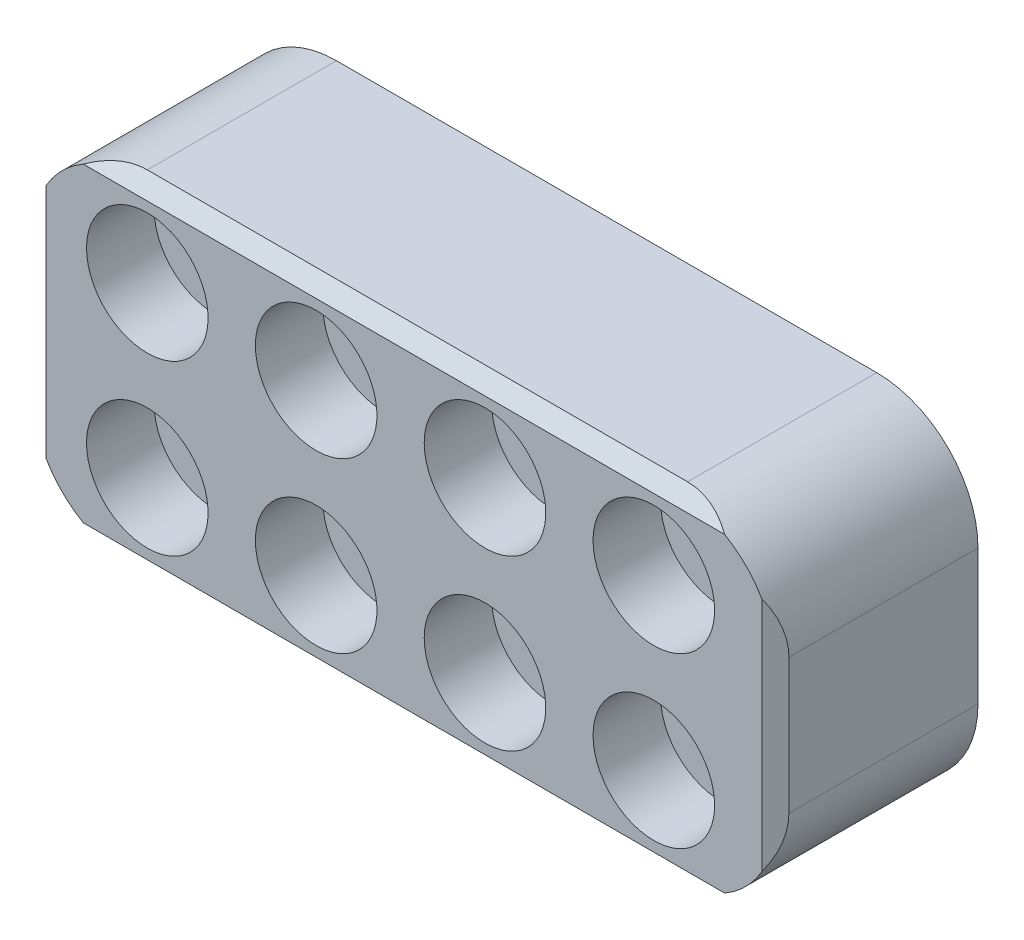
ISO-10303-21;
HEADER;
FILE_DESCRIPTION(('STEP AP214'),'2;1');
FILE_NAME('part.step','',(''),(''),'','','');
FILE_SCHEMA(('AUTOMOTIVE_DESIGN { 1 0 10303 214 1 1 1 1 }'));
ENDSEC;
DATA;
#1=APPLICATION_CONTEXT('core data for automotive mechanical design processes');
#2=APPLICATION_PROTOCOL_DEFINITION('international standard','automotive_design',2000,#1);
#3=PRODUCT_CONTEXT('',#1,'mechanical');
#4=PRODUCT('Part','Part','',(#3));
#5=PRODUCT_RELATED_PRODUCT_CATEGORY('part','',(#4));
#6=PRODUCT_DEFINITION_FORMATION('','',#4);
#7=PRODUCT_DEFINITION_CONTEXT('part definition',#1,'design');
#8=PRODUCT_DEFINITION('design','',#6,#7);
#9=PRODUCT_DEFINITION_SHAPE('','',#8);
#10=(LENGTH_UNIT() NAMED_UNIT(*) SI_UNIT(.MILLI.,.METRE.));
#11=(NAMED_UNIT(*) PLANE_ANGLE_UNIT() SI_UNIT($,.RADIAN.));
#12=(NAMED_UNIT(*) SI_UNIT($,.STERADIAN.) SOLID_ANGLE_UNIT());
#13=UNCERTAINTY_MEASURE_WITH_UNIT(LENGTH_MEASURE(1.E-05),#10,'distance_accuracy_value','');
#14=(GEOMETRIC_REPRESENTATION_CONTEXT(3) GLOBAL_UNCERTAINTY_ASSIGNED_CONTEXT((#13)) GLOBAL_UNIT_ASSIGNED_CONTEXT((#10,
#11,#12)) REPRESENTATION_CONTEXT('',''));
#15=CARTESIAN_POINT('',(0.,0.,0.));
#16=DIRECTION('',(0.,0.,1.));
#17=DIRECTION('',(1.,0.,0.));
#18=AXIS2_PLACEMENT_3D('',#15,#16,#17);
#19=CARTESIAN_POINT('',(0.,0.,0.));
#20=DIRECTION('',(-1.,0.,0.));
#21=DIRECTION('',(0.,0.,1.));
#22=AXIS2_PLACEMENT_3D('',#19,#20,#21);
#23=PLANE('',#22);
#24=DIRECTION('',(0.,0.,-1.));
#25=VECTOR('',#24,1.);
#26=CARTESIAN_POINT('',(0.,-1.5,2.8));
#27=LINE('',#26,#25);
#28=CARTESIAN_POINT('',(0.,-1.5,2.8));
#29=VERTEX_POINT('',#28);
#30=CARTESIAN_POINT('',(0.,-1.5,0.));
#31=VERTEX_POINT('',#30);
#32=EDGE_CURVE('E248',#29,#31,#27,.T.);
#33=ORIENTED_EDGE('',*,*,#32,.T.);
#34=DIRECTION('',(0.,-1.,0.));
#35=VECTOR('',#34,1.);
#36=CARTESIAN_POINT('',(0.,-1.5,0.));
#37=LINE('',#36,#35);
#38=CARTESIAN_POINT('',(0.,-3.5,0.));
#39=VERTEX_POINT('',#38);
#40=EDGE_CURVE('E336',#31,#39,#37,.T.);
#41=ORIENTED_EDGE('',*,*,#40,.T.);
#42=DIRECTION('',(0.,0.,-1.));
#43=VECTOR('',#42,1.);
#44=CARTESIAN_POINT('',(0.,-3.5,2.8));
#45=LINE('',#44,#43);
#46=CARTESIAN_POINT('',(0.,-3.5,2.8));
#47=VERTEX_POINT('',#46);
#48=EDGE_CURVE('E288',#47,#39,#45,.T.);
#49=ORIENTED_EDGE('',*,*,#48,.F.);
#50=DIRECTION('',(0.,-1.,0.));
#51=VECTOR('',#50,1.);
#52=CARTESIAN_POINT('',(0.,-1.5,2.8));
#53=LINE('',#52,#51);
#54=EDGE_CURVE('E287',#29,#47,#53,.T.);
#55=ORIENTED_EDGE('',*,*,#54,.F.);
#56=EDGE_LOOP('',(#33,#41,#49,#55));
#57=FACE_BOUND('',#56,.T.);
#58=ADVANCED_FACE('F17',(#57),#23,.T.);
#59=CARTESIAN_POINT('',(11.,0.,0.));
#60=DIRECTION('',(0.,1.,0.));
#61=DIRECTION('',(1.,0.,0.));
#62=AXIS2_PLACEMENT_3D('',#59,#60,#61);
#63=PLANE('',#62);
#64=DIRECTION('',(0.,0.,-1.));
#65=VECTOR('',#64,1.);
#66=CARTESIAN_POINT('',(9.5,0.,2.8));
#67=LINE('',#66,#65);
#68=CARTESIAN_POINT('',(9.5,0.,2.8));
#69=VERTEX_POINT('',#68);
#70=CARTESIAN_POINT('',(9.5,0.,0.));
#71=VERTEX_POINT('',#70);
#72=EDGE_CURVE('E28',#69,#71,#67,.T.);
#73=ORIENTED_EDGE('',*,*,#72,.T.);
#74=DIRECTION('',(-1.,0.,0.));
#75=VECTOR('',#74,1.);
#76=CARTESIAN_POINT('',(9.5,0.,0.));
#77=LINE('',#76,#75);
#78=CARTESIAN_POINT('',(1.5,0.,0.));
#79=VERTEX_POINT('',#78);
#80=EDGE_CURVE('E485',#71,#79,#77,.T.);
#81=ORIENTED_EDGE('',*,*,#80,.T.);
#82=DIRECTION('',(0.,0.,-1.));
#83=VECTOR('',#82,1.);
#84=CARTESIAN_POINT('',(1.5,0.,2.8));
#85=LINE('',#84,#83);
#86=CARTESIAN_POINT('',(1.5,0.,2.8));
#87=VERTEX_POINT('',#86);
#88=EDGE_CURVE('E367',#87,#79,#85,.T.);
#89=ORIENTED_EDGE('',*,*,#88,.F.);
#90=DIRECTION('',(-1.,0.,0.));
#91=VECTOR('',#90,1.);
#92=CARTESIAN_POINT('',(9.5,0.,2.8));
#93=LINE('',#92,#91);
#94=EDGE_CURVE('E247',#69,#87,#93,.T.);
#95=ORIENTED_EDGE('',*,*,#94,.F.);
#96=EDGE_LOOP('',(#73,#81,#89,#95));
#97=FACE_BOUND('',#96,.T.);
#98=ADVANCED_FACE('F525',(#97),#63,.T.);
#99=CARTESIAN_POINT('',(11.,-5.,0.));
#100=DIRECTION('',(1.,0.,0.));
#101=DIRECTION('',(0.,1.,0.));
#102=AXIS2_PLACEMENT_3D('',#99,#100,#101);
#103=PLANE('',#102);
#104=DIRECTION('',(0.,0.,-1.));
#105=VECTOR('',#104,1.);
#106=CARTESIAN_POINT('',(11.,-3.5,2.8));
#107=LINE('',#106,#105);
#108=CARTESIAN_POINT('',(11.,-3.5,2.8));
#109=VERTEX_POINT('',#108);
#110=CARTESIAN_POINT('',(11.,-3.5,0.));
#111=VERTEX_POINT('',#110);
#112=EDGE_CURVE('E446',#109,#111,#107,.T.);
#113=ORIENTED_EDGE('',*,*,#112,.T.);
#114=DIRECTION('',(0.,1.,0.));
#115=VECTOR('',#114,1.);
#116=CARTESIAN_POINT('',(11.,-3.5,0.));
#117=LINE('',#116,#115);
#118=CARTESIAN_POINT('',(11.,-1.5,0.));
#119=VERTEX_POINT('',#118);
#120=EDGE_CURVE('E368',#111,#119,#117,.T.);
#121=ORIENTED_EDGE('',*,*,#120,.T.);
#122=DIRECTION('',(0.,0.,-1.));
#123=VECTOR('',#122,1.);
#124=CARTESIAN_POINT('',(11.,-1.5,2.8));
#125=LINE('',#124,#123);
#126=CARTESIAN_POINT('',(11.,-1.5,2.8));
#127=VERTEX_POINT('',#126);
#128=EDGE_CURVE('E318',#127,#119,#125,.T.);
#129=ORIENTED_EDGE('',*,*,#128,.F.);
#130=DIRECTION('',(0.,1.,0.));
#131=VECTOR('',#130,1.);
#132=CARTESIAN_POINT('',(11.,-3.5,2.8));
#133=LINE('',#132,#131);
#134=EDGE_CURVE('E11',#109,#127,#133,.T.);
#135=ORIENTED_EDGE('',*,*,#134,.F.);
#136=EDGE_LOOP('',(#113,#121,#129,#135));
#137=FACE_BOUND('',#136,.T.);
#138=ADVANCED_FACE('F574',(#137),#103,.T.);
#139=CARTESIAN_POINT('',(10.8,-5.,3.));
#140=DIRECTION('',(-0.707106781186548,0.,-0.707106781186548));
#141=DIRECTION('',(-0.707106781186548,0.,0.707106781186548));
#142=AXIS2_PLACEMENT_3D('',#139,#140,#141);
#143=PLANE('',#142);
#144=CARTESIAN_POINT('',(9.5,-3.5,4.3));
#145=DIRECTION('',(-0.707106781186548,0.,-0.707106781186548));
#146=DIRECTION('',(0.707106781186548,0.,-0.707106781186548));
#147=AXIS2_PLACEMENT_3D('',#144,#145,#146);
#148=ELLIPSE('',#147,2.12132034355964,1.5);
#149=CARTESIAN_POINT('',(10.8,-4.248331477355,3.));
#150=VERTEX_POINT('',#149);
#151=EDGE_CURVE('E449',#109,#150,#148,.T.);
#152=ORIENTED_EDGE('',*,*,#151,.F.);
#153=ORIENTED_EDGE('',*,*,#134,.T.);
#154=CARTESIAN_POINT('',(9.5,-1.5,4.3));
#155=DIRECTION('',(-0.707106781186548,0.,-0.707106781186548));
#156=DIRECTION('',(0.707106781186548,0.,-0.707106781186548));
#157=AXIS2_PLACEMENT_3D('',#154,#155,#156);
#158=ELLIPSE('',#157,2.12132034355964,1.5);
#159=CARTESIAN_POINT('',(10.8,-0.7516685226452,3.));
#160=VERTEX_POINT('',#159);
#161=EDGE_CURVE('E320',#160,#127,#158,.T.);
#162=ORIENTED_EDGE('',*,*,#161,.F.);
#163=DIRECTION('',(0.,1.,0.));
#164=VECTOR('',#163,1.);
#165=CARTESIAN_POINT('',(10.8,-4.248331477355,3.));
#166=LINE('',#165,#164);
#167=EDGE_CURVE('E264',#150,#160,#166,.T.);
#168=ORIENTED_EDGE('',*,*,#167,.F.);
#169=EDGE_LOOP('',(#152,#153,#162,#168));
#170=FACE_BOUND('',#169,.T.);
#171=ADVANCED_FACE('F721',(#170),#143,.F.);
#172=CARTESIAN_POINT('',(9.5,-1.5,6.9108));
#173=DIRECTION('',(0.,0.,-1.));
#174=DIRECTION('',(0.,1.,0.));
#175=AXIS2_PLACEMENT_3D('',#172,#173,#174);
#176=CYLINDRICAL_SURFACE('',#175,1.5);
#177=ORIENTED_EDGE('',*,*,#161,.T.);
#178=ORIENTED_EDGE('',*,*,#128,.T.);
#179=CARTESIAN_POINT('',(9.5,-1.5,0.));
#180=DIRECTION('',(0.,0.,-1.));
#181=DIRECTION('',(0.,1.,0.));
#182=AXIS2_PLACEMENT_3D('',#179,#180,#181);
#183=CIRCLE('',#182,1.5);
#184=EDGE_CURVE('E373',#71,#119,#183,.T.);
#185=ORIENTED_EDGE('',*,*,#184,.F.);
#186=ORIENTED_EDGE('',*,*,#72,.F.);
#187=CARTESIAN_POINT('',(9.5,-1.5,4.3));
#188=DIRECTION('',(0.,-0.707106781186548,-0.707106781186548));
#189=DIRECTION('',(0.,0.707106781186548,-0.707106781186548));
#190=AXIS2_PLACEMENT_3D('',#187,#188,#189);
#191=ELLIPSE('',#190,2.12132034355964,1.5);
#192=CARTESIAN_POINT('',(10.24833147735,-0.2,3.));
#193=VERTEX_POINT('',#192);
#194=EDGE_CURVE('E236',#69,#193,#191,.T.);
#195=ORIENTED_EDGE('',*,*,#194,.T.);
#196=CARTESIAN_POINT('',(9.5,-1.5,3.));
#197=DIRECTION('',(0.,0.,-1.));
#198=DIRECTION('',(0.498887651569875,0.866666666666657,0.));
#199=AXIS2_PLACEMENT_3D('',#196,#197,#198);
#200=CIRCLE('',#199,1.5);
#201=EDGE_CURVE('E241',#193,#160,#200,.T.);
#202=ORIENTED_EDGE('',*,*,#201,.T.);
#203=EDGE_LOOP('',(#177,#178,#185,#186,#195,#202));
#204=FACE_BOUND('',#203,.T.);
#205=ADVANCED_FACE('F239',(#204),#176,.T.);
#206=CARTESIAN_POINT('',(11.,-0.2,3.));
#207=DIRECTION('',(0.,-0.707106781186548,-0.707106781186548));
#208=DIRECTION('',(0.,-0.707106781186548,0.707106781186548));
#209=AXIS2_PLACEMENT_3D('',#206,#207,#208);
#210=PLANE('',#209);
#211=ORIENTED_EDGE('',*,*,#194,.F.);
#212=ORIENTED_EDGE('',*,*,#94,.T.);
#213=CARTESIAN_POINT('',(1.5,-1.5,4.3));
#214=DIRECTION('',(0.,-0.707106781186548,-0.707106781186548));
#215=DIRECTION('',(0.,0.707106781186548,-0.707106781186548));
#216=AXIS2_PLACEMENT_3D('',#213,#214,#215);
#217=ELLIPSE('',#216,2.12132034355964,1.5);
#218=CARTESIAN_POINT('',(0.7516685226452,-0.2,3.));
#219=VERTEX_POINT('',#218);
#220=EDGE_CURVE('E254',#219,#87,#217,.T.);
#221=ORIENTED_EDGE('',*,*,#220,.F.);
#222=DIRECTION('',(-1.,0.,0.));
#223=VECTOR('',#222,1.);
#224=CARTESIAN_POINT('',(10.24833147735,-0.2,3.));
#225=LINE('',#224,#223);
#226=EDGE_CURVE('E251',#193,#219,#225,.T.);
#227=ORIENTED_EDGE('',*,*,#226,.F.);
#228=EDGE_LOOP('',(#211,#212,#221,#227));
#229=FACE_BOUND('',#228,.T.);
#230=ADVANCED_FACE('F252',(#229),#210,.F.);
#231=CARTESIAN_POINT('',(1.5,-1.5,6.9108));
#232=DIRECTION('',(0.,0.,-1.));
#233=DIRECTION('',(-1.,0.,0.));
#234=AXIS2_PLACEMENT_3D('',#231,#232,#233);
#235=CYLINDRICAL_SURFACE('',#234,1.5);
#236=ORIENTED_EDGE('',*,*,#220,.T.);
#237=ORIENTED_EDGE('',*,*,#88,.T.);
#238=CARTESIAN_POINT('',(1.5,-1.5,0.));
#239=DIRECTION('',(0.,0.,-1.));
#240=DIRECTION('',(-1.,0.,0.));
#241=AXIS2_PLACEMENT_3D('',#238,#239,#240);
#242=CIRCLE('',#241,1.5);
#243=EDGE_CURVE('E340',#31,#79,#242,.T.);
#244=ORIENTED_EDGE('',*,*,#243,.F.);
#245=ORIENTED_EDGE('',*,*,#32,.F.);
#246=CARTESIAN_POINT('',(1.5,-1.5,4.3));
#247=DIRECTION('',(0.707106781186548,0.,-0.707106781186548));
#248=DIRECTION('',(-0.707106781186548,0.,-0.707106781186548));
#249=AXIS2_PLACEMENT_3D('',#246,#247,#248);
#250=ELLIPSE('',#249,2.12132034355964,1.5);
#251=CARTESIAN_POINT('',(0.2,-0.7516685226452,3.));
#252=VERTEX_POINT('',#251);
#253=EDGE_CURVE('E283',#29,#252,#250,.T.);
#254=ORIENTED_EDGE('',*,*,#253,.T.);
#255=CARTESIAN_POINT('',(1.5,-1.5,3.));
#256=DIRECTION('',(0.,0.,-1.));
#257=DIRECTION('',(-0.866666666666657,0.498887651569875,0.));
#258=AXIS2_PLACEMENT_3D('',#255,#256,#257);
#259=CIRCLE('',#258,1.5);
#260=EDGE_CURVE('E259',#252,#219,#259,.T.);
#261=ORIENTED_EDGE('',*,*,#260,.T.);
#262=EDGE_LOOP('',(#236,#237,#244,#245,#254,#261));
#263=FACE_BOUND('',#262,.T.);
#264=ADVANCED_FACE('F532',(#263),#235,.T.);
#265=CARTESIAN_POINT('',(0.2,0.,3.));
#266=DIRECTION('',(0.707106781186548,0.,-0.707106781186548));
#267=DIRECTION('',(0.,-1.,0.));
#268=AXIS2_PLACEMENT_3D('',#265,#266,#267);
#269=PLANE('',#268);
#270=ORIENTED_EDGE('',*,*,#253,.F.);
#271=ORIENTED_EDGE('',*,*,#54,.T.);
#272=CARTESIAN_POINT('',(1.5,-3.5,4.3));
#273=DIRECTION('',(0.707106781186548,0.,-0.707106781186548));
#274=DIRECTION('',(-0.707106781186548,0.,-0.707106781186548));
#275=AXIS2_PLACEMENT_3D('',#272,#273,#274);
#276=ELLIPSE('',#275,2.12132034355964,1.5);
#277=CARTESIAN_POINT('',(0.2,-4.248331477355,3.));
#278=VERTEX_POINT('',#277);
#279=EDGE_CURVE('E386',#278,#47,#276,.T.);
#280=ORIENTED_EDGE('',*,*,#279,.F.);
#281=DIRECTION('',(0.,-1.,0.));
#282=VECTOR('',#281,1.);
#283=CARTESIAN_POINT('',(0.2,-0.7516685226452,3.));
#284=LINE('',#283,#282);
#285=EDGE_CURVE('E359',#252,#278,#284,.T.);
#286=ORIENTED_EDGE('',*,*,#285,.F.);
#287=EDGE_LOOP('',(#270,#271,#280,#286));
#288=FACE_BOUND('',#287,.T.);
#289=ADVANCED_FACE('F19',(#288),#269,.F.);
#290=CARTESIAN_POINT('',(1.5,-3.5,6.9108));
#291=DIRECTION('',(0.,0.,-1.));
#292=DIRECTION('',(0.,-1.,0.));
#293=AXIS2_PLACEMENT_3D('',#290,#291,#292);
#294=CYLINDRICAL_SURFACE('',#293,1.5);
#295=ORIENTED_EDGE('',*,*,#279,.T.);
#296=ORIENTED_EDGE('',*,*,#48,.T.);
#297=CARTESIAN_POINT('',(1.5,-3.5,0.));
#298=DIRECTION('',(0.,0.,-1.));
#299=DIRECTION('',(0.,-1.,0.));
#300=AXIS2_PLACEMENT_3D('',#297,#298,#299);
#301=CIRCLE('',#300,1.5);
#302=CARTESIAN_POINT('',(1.5,-5.,0.));
#303=VERTEX_POINT('',#302);
#304=EDGE_CURVE('E341',#303,#39,#301,.T.);
#305=ORIENTED_EDGE('',*,*,#304,.F.);
#306=DIRECTION('',(0.,0.,-1.));
#307=VECTOR('',#306,1.);
#308=CARTESIAN_POINT('',(1.5,-5.,2.8));
#309=LINE('',#308,#307);
#310=CARTESIAN_POINT('',(1.5,-5.,2.8));
#311=VERTEX_POINT('',#310);
#312=EDGE_CURVE('E383',#311,#303,#309,.T.);
#313=ORIENTED_EDGE('',*,*,#312,.F.);
#314=CARTESIAN_POINT('',(1.5,-3.5,4.3));
#315=DIRECTION('',(0.,0.707106781186548,-0.707106781186548));
#316=DIRECTION('',(0.,-0.707106781186548,-0.707106781186548));
#317=AXIS2_PLACEMENT_3D('',#314,#315,#316);
#318=ELLIPSE('',#317,2.12132034355964,1.5);
#319=CARTESIAN_POINT('',(0.7516685226452,-4.8,3.));
#320=VERTEX_POINT('',#319);
#321=EDGE_CURVE('E457',#311,#320,#318,.T.);
#322=ORIENTED_EDGE('',*,*,#321,.T.);
#323=CARTESIAN_POINT('',(1.5,-3.5,3.));
#324=DIRECTION('',(0.,0.,-1.));
#325=DIRECTION('',(-0.498887651569875,-0.866666666666657,0.));
#326=AXIS2_PLACEMENT_3D('',#323,#324,#325);
#327=CIRCLE('',#326,1.5);
#328=EDGE_CURVE('E21',#320,#278,#327,.T.);
#329=ORIENTED_EDGE('',*,*,#328,.T.);
#330=EDGE_LOOP('',(#295,#296,#305,#313,#322,#329));
#331=FACE_BOUND('',#330,.T.);
#332=ADVANCED_FACE('F742',(#331),#294,.T.);
#333=CARTESIAN_POINT('',(0.,-5.,0.));
#334=DIRECTION('',(0.,-1.,0.));
#335=DIRECTION('',(0.,0.,-1.));
#336=AXIS2_PLACEMENT_3D('',#333,#334,#335);
#337=PLANE('',#336);
#338=DIRECTION('',(0.,0.,-1.));
#339=VECTOR('',#338,1.);
#340=CARTESIAN_POINT('',(9.5,-5.,2.8));
#341=LINE('',#340,#339);
#342=CARTESIAN_POINT('',(9.5,-5.,2.8));
#343=VERTEX_POINT('',#342);
#344=CARTESIAN_POINT('',(9.5,-5.,0.));
#345=VERTEX_POINT('',#344);
#346=EDGE_CURVE('E450',#343,#345,#341,.T.);
#347=ORIENTED_EDGE('',*,*,#346,.F.);
#348=DIRECTION('',(1.,0.,0.));
#349=VECTOR('',#348,1.);
#350=CARTESIAN_POINT('',(1.5,-5.,2.8));
#351=LINE('',#350,#349);
#352=EDGE_CURVE('E387',#311,#343,#351,.T.);
#353=ORIENTED_EDGE('',*,*,#352,.F.);
#354=ORIENTED_EDGE('',*,*,#312,.T.);
#355=DIRECTION('',(1.,0.,0.));
#356=VECTOR('',#355,1.);
#357=CARTESIAN_POINT('',(1.5,-5.,0.));
#358=LINE('',#357,#356);
#359=EDGE_CURVE('E408',#303,#345,#358,.T.);
#360=ORIENTED_EDGE('',*,*,#359,.T.);
#361=EDGE_LOOP('',(#347,#353,#354,#360));
#362=FACE_BOUND('',#361,.T.);
#363=ADVANCED_FACE('F738',(#362),#337,.T.);
#364=CARTESIAN_POINT('',(0.,-4.8,3.));
#365=DIRECTION('',(0.,0.707106781186548,-0.707106781186548));
#366=DIRECTION('',(-1.,0.,0.));
#367=AXIS2_PLACEMENT_3D('',#364,#365,#366);
#368=PLANE('',#367);
#369=CARTESIAN_POINT('',(9.5,-3.5,4.3));
#370=DIRECTION('',(0.,0.707106781186548,-0.707106781186548));
#371=DIRECTION('',(0.,-0.707106781186548,-0.707106781186548));
#372=AXIS2_PLACEMENT_3D('',#369,#370,#371);
#373=ELLIPSE('',#372,2.12132034355964,1.5);
#374=CARTESIAN_POINT('',(10.24833147735,-4.8,3.));
#375=VERTEX_POINT('',#374);
#376=EDGE_CURVE('E472',#375,#343,#373,.T.);
#377=ORIENTED_EDGE('',*,*,#376,.F.);
#378=DIRECTION('',(1.,0.,0.));
#379=VECTOR('',#378,1.);
#380=CARTESIAN_POINT('',(0.7516685226452,-4.8,3.));
#381=LINE('',#380,#379);
#382=EDGE_CURVE('E360',#320,#375,#381,.T.);
#383=ORIENTED_EDGE('',*,*,#382,.F.);
#384=ORIENTED_EDGE('',*,*,#321,.F.);
#385=ORIENTED_EDGE('',*,*,#352,.T.);
#386=EDGE_LOOP('',(#377,#383,#384,#385));
#387=FACE_BOUND('',#386,.T.);
#388=ADVANCED_FACE('F1020',(#387),#368,.F.);
#389=CARTESIAN_POINT('',(9.5,-3.5,6.9108));
#390=DIRECTION('',(0.,0.,-1.));
#391=DIRECTION('',(1.,0.,0.));
#392=AXIS2_PLACEMENT_3D('',#389,#390,#391);
#393=CYLINDRICAL_SURFACE('',#392,1.5);
#394=ORIENTED_EDGE('',*,*,#376,.T.);
#395=ORIENTED_EDGE('',*,*,#346,.T.);
#396=CARTESIAN_POINT('',(9.5,-3.5,0.));
#397=DIRECTION('',(0.,0.,-1.));
#398=DIRECTION('',(1.,0.,0.));
#399=AXIS2_PLACEMENT_3D('',#396,#397,#398);
#400=CIRCLE('',#399,1.5);
#401=EDGE_CURVE('E404',#111,#345,#400,.T.);
#402=ORIENTED_EDGE('',*,*,#401,.F.);
#403=ORIENTED_EDGE('',*,*,#112,.F.);
#404=ORIENTED_EDGE('',*,*,#151,.T.);
#405=CARTESIAN_POINT('',(9.5,-3.5,3.));
#406=DIRECTION('',(0.,0.,-1.));
#407=DIRECTION('',(0.866666666666657,-0.498887651569875,0.));
#408=AXIS2_PLACEMENT_3D('',#405,#406,#407);
#409=CIRCLE('',#408,1.5);
#410=EDGE_CURVE('E271',#150,#375,#409,.T.);
#411=ORIENTED_EDGE('',*,*,#410,.T.);
#412=EDGE_LOOP('',(#394,#395,#402,#403,#404,#411));
#413=FACE_BOUND('',#412,.T.);
#414=ADVANCED_FACE('F719',(#413),#393,.T.);
#415=CARTESIAN_POINT('',(9.2,-1.25,3.15));
#416=DIRECTION('',(0.,0.,-1.));
#417=DIRECTION('',(1.,0.,0.));
#418=AXIS2_PLACEMENT_3D('',#415,#416,#417);
#419=CYLINDRICAL_SURFACE('',#418,0.5);
#420=CARTESIAN_POINT('',(9.2,-1.25,2.));
#421=DIRECTION('',(0.,0.,-1.));
#422=DIRECTION('',(1.,0.,0.));
#423=AXIS2_PLACEMENT_3D('',#420,#421,#422);
#424=CIRCLE('',#423,0.5);
#425=CARTESIAN_POINT('',(8.7,-1.25,2.));
#426=VERTEX_POINT('',#425);
#427=EDGE_CURVE('E277',#426,#426,#424,.T.);
#428=ORIENTED_EDGE('',*,*,#427,.F.);
#429=DIRECTION('',(0.,0.,-1.));
#430=VECTOR('',#429,1.);
#431=CARTESIAN_POINT('',(8.7,-1.25,3.15));
#432=LINE('',#431,#430);
#433=CARTESIAN_POINT('',(8.7,-1.25,0.));
#434=VERTEX_POINT('',#433);
#435=EDGE_CURVE('E281',#426,#434,#432,.T.);
#436=ORIENTED_EDGE('',*,*,#435,.T.);
#437=CARTESIAN_POINT('',(9.2,-1.25,0.));
#438=DIRECTION('',(0.,0.,-1.));
#439=DIRECTION('',(1.,0.,0.));
#440=AXIS2_PLACEMENT_3D('',#437,#438,#439);
#441=CIRCLE('',#440,0.5);
#442=EDGE_CURVE('E300',#434,#434,#441,.T.);
#443=ORIENTED_EDGE('',*,*,#442,.T.);
#444=ORIENTED_EDGE('',*,*,#435,.F.);
#445=EDGE_LOOP('',(#428,#436,#443,#444));
#446=FACE_BOUND('',#445,.T.);
#447=ADVANCED_FACE('F716',(#446),#419,.F.);
#448=CARTESIAN_POINT('',(9.2,-1.25,2.));
#449=DIRECTION('',(0.,0.,-1.));
#450=DIRECTION('',(0.,-1.,0.));
#451=AXIS2_PLACEMENT_3D('',#448,#449,#450);
#452=PLANE('',#451);
#453=ORIENTED_EDGE('',*,*,#427,.T.);
#454=EDGE_LOOP('',(#453));
#455=FACE_BOUND('',#454,.T.);
#456=CARTESIAN_POINT('',(9.2,-1.25,2.));
#457=DIRECTION('',(0.,0.,-1.));
#458=DIRECTION('',(1.,0.,0.));
#459=AXIS2_PLACEMENT_3D('',#456,#457,#458);
#460=CIRCLE('',#459,0.9);
#461=CARTESIAN_POINT('',(8.3,-1.25,2.));
#462=VERTEX_POINT('',#461);
#463=EDGE_CURVE('E282',#462,#462,#460,.T.);
#464=ORIENTED_EDGE('',*,*,#463,.F.);
#465=EDGE_LOOP('',(#464));
#466=FACE_BOUND('',#465,.T.);
#467=ADVANCED_FACE('F718',(#455,#466),#452,.F.);
#468=CARTESIAN_POINT('',(9.2,-1.25,3.15));
#469=DIRECTION('',(0.,0.,-1.));
#470=DIRECTION('',(1.,0.,0.));
#471=AXIS2_PLACEMENT_3D('',#468,#469,#470);
#472=CYLINDRICAL_SURFACE('',#471,0.9);
#473=CARTESIAN_POINT('',(9.2,-1.25,3.));
#474=DIRECTION('',(0.,0.,-1.));
#475=DIRECTION('',(1.,0.,0.));
#476=AXIS2_PLACEMENT_3D('',#473,#474,#475);
#477=CIRCLE('',#476,0.9);
#478=CARTESIAN_POINT('',(8.3,-1.25,3.));
#479=VERTEX_POINT('',#478);
#480=EDGE_CURVE('E307',#479,#479,#477,.T.);
#481=ORIENTED_EDGE('',*,*,#480,.F.);
#482=DIRECTION('',(0.,0.,-1.));
#483=VECTOR('',#482,1.);
#484=CARTESIAN_POINT('',(8.3,-1.25,3.15));
#485=LINE('',#484,#483);
#486=EDGE_CURVE('E399',#479,#462,#485,.T.);
#487=ORIENTED_EDGE('',*,*,#486,.T.);
#488=ORIENTED_EDGE('',*,*,#463,.T.);
#489=ORIENTED_EDGE('',*,*,#486,.F.);
#490=EDGE_LOOP('',(#481,#487,#488,#489));
#491=FACE_BOUND('',#490,.T.);
#492=ADVANCED_FACE('F710',(#491),#472,.F.);
#493=CARTESIAN_POINT('',(6.7,-1.25,3.15));
#494=DIRECTION('',(0.,0.,-1.));
#495=DIRECTION('',(1.,0.,0.));
#496=AXIS2_PLACEMENT_3D('',#493,#494,#495);
#497=CYLINDRICAL_SURFACE('',#496,0.5);
#498=CARTESIAN_POINT('',(6.7,-1.25,2.));
#499=DIRECTION('',(0.,0.,-1.));
#500=DIRECTION('',(1.,0.,0.));
#501=AXIS2_PLACEMENT_3D('',#498,#499,#500);
#502=CIRCLE('',#501,0.5);
#503=CARTESIAN_POINT('',(6.2,-1.25,2.));
#504=VERTEX_POINT('',#503);
#505=EDGE_CURVE('E301',#504,#504,#502,.T.);
#506=ORIENTED_EDGE('',*,*,#505,.F.);
#507=DIRECTION('',(0.,0.,-1.));
#508=VECTOR('',#507,1.);
#509=CARTESIAN_POINT('',(6.2,-1.25,3.15));
#510=LINE('',#509,#508);
#511=CARTESIAN_POINT('',(6.2,-1.25,0.));
#512=VERTEX_POINT('',#511);
#513=EDGE_CURVE('E305',#504,#512,#510,.T.);
#514=ORIENTED_EDGE('',*,*,#513,.T.);
#515=CARTESIAN_POINT('',(6.7,-1.25,0.));
#516=DIRECTION('',(0.,0.,-1.));
#517=DIRECTION('',(1.,0.,0.));
#518=AXIS2_PLACEMENT_3D('',#515,#516,#517);
#519=CIRCLE('',#518,0.5);
#520=EDGE_CURVE('E414',#512,#512,#519,.T.);
#521=ORIENTED_EDGE('',*,*,#520,.T.);
#522=ORIENTED_EDGE('',*,*,#513,.F.);
#523=EDGE_LOOP('',(#506,#514,#521,#522));
#524=FACE_BOUND('',#523,.T.);
#525=ADVANCED_FACE('F702',(#524),#497,.F.);
#526=CARTESIAN_POINT('',(6.7,-1.25,2.));
#527=DIRECTION('',(0.,0.,-1.));
#528=DIRECTION('',(0.,-1.,0.));
#529=AXIS2_PLACEMENT_3D('',#526,#527,#528);
#530=PLANE('',#529);
#531=ORIENTED_EDGE('',*,*,#505,.T.);
#532=EDGE_LOOP('',(#531));
#533=FACE_BOUND('',#532,.T.);
#534=CARTESIAN_POINT('',(6.7,-1.25,2.));
#535=DIRECTION('',(0.,0.,-1.));
#536=DIRECTION('',(1.,0.,0.));
#537=AXIS2_PLACEMENT_3D('',#534,#535,#536);
#538=CIRCLE('',#537,0.9);
#539=CARTESIAN_POINT('',(5.8,-1.25,2.));
#540=VERTEX_POINT('',#539);
#541=EDGE_CURVE('E306',#540,#540,#538,.T.);
#542=ORIENTED_EDGE('',*,*,#541,.F.);
#543=EDGE_LOOP('',(#542));
#544=FACE_BOUND('',#543,.T.);
#545=ADVANCED_FACE('F700',(#533,#544),#530,.F.);
#546=CARTESIAN_POINT('',(6.7,-1.25,3.15));
#547=DIRECTION('',(0.,0.,-1.));
#548=DIRECTION('',(1.,0.,0.));
#549=AXIS2_PLACEMENT_3D('',#546,#547,#548);
#550=CYLINDRICAL_SURFACE('',#549,0.9);
#551=CARTESIAN_POINT('',(6.7,-1.25,3.));
#552=DIRECTION('',(0.,0.,-1.));
#553=DIRECTION('',(1.,0.,0.));
#554=AXIS2_PLACEMENT_3D('',#551,#552,#553);
#555=CIRCLE('',#554,0.9);
#556=CARTESIAN_POINT('',(5.8,-1.25,3.));
#557=VERTEX_POINT('',#556);
#558=EDGE_CURVE('E312',#557,#557,#555,.T.);
#559=ORIENTED_EDGE('',*,*,#558,.F.);
#560=DIRECTION('',(0.,0.,-1.));
#561=VECTOR('',#560,1.);
#562=CARTESIAN_POINT('',(5.8,-1.25,3.15));
#563=LINE('',#562,#561);
#564=EDGE_CURVE('E465',#557,#540,#563,.T.);
#565=ORIENTED_EDGE('',*,*,#564,.T.);
#566=ORIENTED_EDGE('',*,*,#541,.T.);
#567=ORIENTED_EDGE('',*,*,#564,.F.);
#568=EDGE_LOOP('',(#559,#565,#566,#567));
#569=FACE_BOUND('',#568,.T.);
#570=ADVANCED_FACE('F602',(#569),#550,.F.);
#571=CARTESIAN_POINT('',(4.2,-1.25,3.15));
#572=DIRECTION('',(0.,0.,-1.));
#573=DIRECTION('',(1.,0.,0.));
#574=AXIS2_PLACEMENT_3D('',#571,#572,#573);
#575=CYLINDRICAL_SURFACE('',#574,0.5);
#576=CARTESIAN_POINT('',(4.2,-1.25,2.));
#577=DIRECTION('',(0.,0.,-1.));
#578=DIRECTION('',(1.,0.,0.));
#579=AXIS2_PLACEMENT_3D('',#576,#577,#578);
#580=CIRCLE('',#579,0.5);
#581=CARTESIAN_POINT('',(3.7,-1.25,2.));
#582=VERTEX_POINT('',#581);
#583=EDGE_CURVE('E466',#582,#582,#580,.T.);
#584=ORIENTED_EDGE('',*,*,#583,.F.);
#585=DIRECTION('',(0.,0.,-1.));
#586=VECTOR('',#585,1.);
#587=CARTESIAN_POINT('',(3.7,-1.25,3.15));
#588=LINE('',#587,#586);
#589=CARTESIAN_POINT('',(3.7,-1.25,0.));
#590=VERTEX_POINT('',#589);
#591=EDGE_CURVE('E462',#582,#590,#588,.T.);
#592=ORIENTED_EDGE('',*,*,#591,.T.);
#593=CARTESIAN_POINT('',(4.2,-1.25,0.));
#594=DIRECTION('',(0.,0.,-1.));
#595=DIRECTION('',(1.,0.,0.));
#596=AXIS2_PLACEMENT_3D('',#593,#594,#595);
#597=CIRCLE('',#596,0.5);
#598=EDGE_CURVE('E418',#590,#590,#597,.T.);
#599=ORIENTED_EDGE('',*,*,#598,.T.);
#600=ORIENTED_EDGE('',*,*,#591,.F.);
#601=EDGE_LOOP('',(#584,#592,#599,#600));
#602=FACE_BOUND('',#601,.T.);
#603=ADVANCED_FACE('F593',(#602),#575,.F.);
#604=CARTESIAN_POINT('',(4.2,-1.25,2.));
#605=DIRECTION('',(0.,0.,-1.));
#606=DIRECTION('',(0.,-1.,0.));
#607=AXIS2_PLACEMENT_3D('',#604,#605,#606);
#608=PLANE('',#607);
#609=ORIENTED_EDGE('',*,*,#583,.T.);
#610=EDGE_LOOP('',(#609));
#611=FACE_BOUND('',#610,.T.);
#612=CARTESIAN_POINT('',(4.2,-1.25,2.));
#613=DIRECTION('',(0.,0.,-1.));
#614=DIRECTION('',(1.,0.,0.));
#615=AXIS2_PLACEMENT_3D('',#612,#613,#614);
#616=CIRCLE('',#615,0.9);
#617=CARTESIAN_POINT('',(3.3,-1.25,2.));
#618=VERTEX_POINT('',#617);
#619=EDGE_CURVE('E275',#618,#618,#616,.T.);
#620=ORIENTED_EDGE('',*,*,#619,.F.);
#621=EDGE_LOOP('',(#620));
#622=FACE_BOUND('',#621,.T.);
#623=ADVANCED_FACE('F590',(#611,#622),#608,.F.);
#624=CARTESIAN_POINT('',(4.2,-1.25,3.15));
#625=DIRECTION('',(0.,0.,-1.));
#626=DIRECTION('',(1.,0.,0.));
#627=AXIS2_PLACEMENT_3D('',#624,#625,#626);
#628=CYLINDRICAL_SURFACE('',#627,0.9);
#629=CARTESIAN_POINT('',(4.2,-1.25,3.));
#630=DIRECTION('',(0.,0.,-1.));
#631=DIRECTION('',(1.,0.,0.));
#632=AXIS2_PLACEMENT_3D('',#629,#630,#631);
#633=CIRCLE('',#632,0.9);
#634=CARTESIAN_POINT('',(3.3,-1.25,3.));
#635=VERTEX_POINT('',#634);
#636=EDGE_CURVE('E351',#635,#635,#633,.T.);
#637=ORIENTED_EDGE('',*,*,#636,.F.);
#638=DIRECTION('',(0.,0.,-1.));
#639=VECTOR('',#638,1.);
#640=CARTESIAN_POINT('',(3.3,-1.25,3.15));
#641=LINE('',#640,#639);
#642=EDGE_CURVE('E496',#635,#618,#641,.T.);
#643=ORIENTED_EDGE('',*,*,#642,.T.);
#644=ORIENTED_EDGE('',*,*,#619,.T.);
#645=ORIENTED_EDGE('',*,*,#642,.F.);
#646=EDGE_LOOP('',(#637,#643,#644,#645));
#647=FACE_BOUND('',#646,.T.);
#648=ADVANCED_FACE('F592',(#647),#628,.F.);
#649=CARTESIAN_POINT('',(1.7,-1.25,3.15));
#650=DIRECTION('',(0.,0.,-1.));
#651=DIRECTION('',(1.,0.,0.));
#652=AXIS2_PLACEMENT_3D('',#649,#650,#651);
#653=CYLINDRICAL_SURFACE('',#652,0.5);
#654=CARTESIAN_POINT('',(1.7,-1.25,2.));
#655=DIRECTION('',(0.,0.,-1.));
#656=DIRECTION('',(1.,0.,0.));
#657=AXIS2_PLACEMENT_3D('',#654,#655,#656);
#658=CIRCLE('',#657,0.5);
#659=CARTESIAN_POINT('',(1.2,-1.25,2.));
#660=VERTEX_POINT('',#659);
#661=EDGE_CURVE('E289',#660,#660,#658,.T.);
#662=ORIENTED_EDGE('',*,*,#661,.F.);
#663=DIRECTION('',(0.,0.,-1.));
#664=VECTOR('',#663,1.);
#665=CARTESIAN_POINT('',(1.2,-1.25,3.15));
#666=LINE('',#665,#664);
#667=CARTESIAN_POINT('',(1.2,-1.25,0.));
#668=VERTEX_POINT('',#667);
#669=EDGE_CURVE('E292',#660,#668,#666,.T.);
#670=ORIENTED_EDGE('',*,*,#669,.T.);
#671=CARTESIAN_POINT('',(1.7,-1.25,0.));
#672=DIRECTION('',(0.,0.,-1.));
#673=DIRECTION('',(1.,0.,0.));
#674=AXIS2_PLACEMENT_3D('',#671,#672,#673);
#675=CIRCLE('',#674,0.5);
#676=EDGE_CURVE('E328',#668,#668,#675,.T.);
#677=ORIENTED_EDGE('',*,*,#676,.T.);
#678=ORIENTED_EDGE('',*,*,#669,.F.);
#679=EDGE_LOOP('',(#662,#670,#677,#678));
#680=FACE_BOUND('',#679,.T.);
#681=ADVANCED_FACE('F599',(#680),#653,.F.);
#682=CARTESIAN_POINT('',(1.7,-1.25,2.));
#683=DIRECTION('',(0.,0.,-1.));
#684=DIRECTION('',(0.,-1.,0.));
#685=AXIS2_PLACEMENT_3D('',#682,#683,#684);
#686=PLANE('',#685);
#687=ORIENTED_EDGE('',*,*,#661,.T.);
#688=EDGE_LOOP('',(#687));
#689=FACE_BOUND('',#688,.T.);
#690=CARTESIAN_POINT('',(1.7,-1.25,2.));
#691=DIRECTION('',(0.,0.,-1.));
#692=DIRECTION('',(1.,0.,0.));
#693=AXIS2_PLACEMENT_3D('',#690,#691,#692);
#694=CIRCLE('',#693,0.9);
#695=CARTESIAN_POINT('',(0.8,-1.25,2.));
#696=VERTEX_POINT('',#695);
#697=EDGE_CURVE('E293',#696,#696,#694,.T.);
#698=ORIENTED_EDGE('',*,*,#697,.F.);
#699=EDGE_LOOP('',(#698));
#700=FACE_BOUND('',#699,.T.);
#701=ADVANCED_FACE('F636',(#689,#700),#686,.F.);
#702=CARTESIAN_POINT('',(1.7,-1.25,3.15));
#703=DIRECTION('',(0.,0.,-1.));
#704=DIRECTION('',(1.,0.,0.));
#705=AXIS2_PLACEMENT_3D('',#702,#703,#704);
#706=CYLINDRICAL_SURFACE('',#705,0.9);
#707=CARTESIAN_POINT('',(1.7,-1.25,3.));
#708=DIRECTION('',(0.,0.,-1.));
#709=DIRECTION('',(1.,0.,0.));
#710=AXIS2_PLACEMENT_3D('',#707,#708,#709);
#711=CIRCLE('',#710,0.9);
#712=CARTESIAN_POINT('',(0.8,-1.25,3.));
#713=VERTEX_POINT('',#712);
#714=EDGE_CURVE('E346',#713,#713,#711,.T.);
#715=ORIENTED_EDGE('',*,*,#714,.F.);
#716=DIRECTION('',(0.,0.,-1.));
#717=VECTOR('',#716,1.);
#718=CARTESIAN_POINT('',(0.8,-1.25,3.15));
#719=LINE('',#718,#717);
#720=EDGE_CURVE('E313',#713,#696,#719,.T.);
#721=ORIENTED_EDGE('',*,*,#720,.T.);
#722=ORIENTED_EDGE('',*,*,#697,.T.);
#723=ORIENTED_EDGE('',*,*,#720,.F.);
#724=EDGE_LOOP('',(#715,#721,#722,#723));
#725=FACE_BOUND('',#724,.T.);
#726=ADVANCED_FACE('F639',(#725),#706,.F.);
#727=CARTESIAN_POINT('',(9.2,-3.75,3.15));
#728=DIRECTION('',(0.,0.,-1.));
#729=DIRECTION('',(1.,0.,0.));
#730=AXIS2_PLACEMENT_3D('',#727,#728,#729);
#731=CYLINDRICAL_SURFACE('',#730,0.5);
#732=CARTESIAN_POINT('',(9.2,-3.75,2.));
#733=DIRECTION('',(0.,0.,-1.));
#734=DIRECTION('',(1.,0.,0.));
#735=AXIS2_PLACEMENT_3D('',#732,#733,#734);
#736=CIRCLE('',#735,0.5);
#737=CARTESIAN_POINT('',(8.7,-3.75,2.));
#738=VERTEX_POINT('',#737);
#739=EDGE_CURVE('E456',#738,#738,#736,.T.);
#740=ORIENTED_EDGE('',*,*,#739,.F.);
#741=DIRECTION('',(0.,0.,-1.));
#742=VECTOR('',#741,1.);
#743=CARTESIAN_POINT('',(8.7,-3.75,3.15));
#744=LINE('',#743,#742);
#745=CARTESIAN_POINT('',(8.7,-3.75,0.));
#746=VERTEX_POINT('',#745);
#747=EDGE_CURVE('E317',#738,#746,#744,.T.);
#748=ORIENTED_EDGE('',*,*,#747,.T.);
#749=CARTESIAN_POINT('',(9.2,-3.75,0.));
#750=DIRECTION('',(0.,0.,-1.));
#751=DIRECTION('',(1.,0.,0.));
#752=AXIS2_PLACEMENT_3D('',#749,#750,#751);
#753=CIRCLE('',#752,0.5);
#754=EDGE_CURVE('E324',#746,#746,#753,.T.);
#755=ORIENTED_EDGE('',*,*,#754,.T.);
#756=ORIENTED_EDGE('',*,*,#747,.F.);
#757=EDGE_LOOP('',(#740,#748,#755,#756));
#758=FACE_BOUND('',#757,.T.);
#759=ADVANCED_FACE('F677',(#758),#731,.F.);
#760=CARTESIAN_POINT('',(9.2,-3.75,2.));
#761=DIRECTION('',(0.,0.,-1.));
#762=DIRECTION('',(0.,-1.,0.));
#763=AXIS2_PLACEMENT_3D('',#760,#761,#762);
#764=PLANE('',#763);
#765=ORIENTED_EDGE('',*,*,#739,.T.);
#766=EDGE_LOOP('',(#765));
#767=FACE_BOUND('',#766,.T.);
#768=CARTESIAN_POINT('',(9.2,-3.75,2.));
#769=DIRECTION('',(0.,0.,-1.));
#770=DIRECTION('',(1.,0.,0.));
#771=AXIS2_PLACEMENT_3D('',#768,#769,#770);
#772=CIRCLE('',#771,0.9);
#773=CARTESIAN_POINT('',(8.3,-3.75,2.));
#774=VERTEX_POINT('',#773);
#775=EDGE_CURVE('E436',#774,#774,#772,.T.);
#776=ORIENTED_EDGE('',*,*,#775,.F.);
#777=EDGE_LOOP('',(#776));
#778=FACE_BOUND('',#777,.T.);
#779=ADVANCED_FACE('F674',(#767,#778),#764,.F.);
#780=CARTESIAN_POINT('',(9.2,-3.75,3.15));
#781=DIRECTION('',(0.,0.,-1.));
#782=DIRECTION('',(1.,0.,0.));
#783=AXIS2_PLACEMENT_3D('',#780,#781,#782);
#784=CYLINDRICAL_SURFACE('',#783,0.9);
#785=CARTESIAN_POINT('',(9.2,-3.75,3.));
#786=DIRECTION('',(0.,0.,-1.));
#787=DIRECTION('',(1.,0.,0.));
#788=AXIS2_PLACEMENT_3D('',#785,#786,#787);
#789=CIRCLE('',#788,0.9);
#790=CARTESIAN_POINT('',(8.3,-3.75,3.));
#791=VERTEX_POINT('',#790);
#792=EDGE_CURVE('E342',#791,#791,#789,.T.);
#793=ORIENTED_EDGE('',*,*,#792,.F.);
#794=DIRECTION('',(0.,0.,-1.));
#795=VECTOR('',#794,1.);
#796=CARTESIAN_POINT('',(8.3,-3.75,3.15));
#797=LINE('',#796,#795);
#798=EDGE_CURVE('E395',#791,#774,#797,.T.);
#799=ORIENTED_EDGE('',*,*,#798,.T.);
#800=ORIENTED_EDGE('',*,*,#775,.T.);
#801=ORIENTED_EDGE('',*,*,#798,.F.);
#802=EDGE_LOOP('',(#793,#799,#800,#801));
#803=FACE_BOUND('',#802,.T.);
#804=ADVANCED_FACE('F583',(#803),#784,.F.);
#805=CARTESIAN_POINT('',(6.7,-3.75,3.15));
#806=DIRECTION('',(0.,0.,-1.));
#807=DIRECTION('',(1.,0.,0.));
#808=AXIS2_PLACEMENT_3D('',#805,#806,#807);
#809=CYLINDRICAL_SURFACE('',#808,0.5);
#810=CARTESIAN_POINT('',(6.7,-3.75,2.));
#811=DIRECTION('',(0.,0.,-1.));
#812=DIRECTION('',(1.,0.,0.));
#813=AXIS2_PLACEMENT_3D('',#810,#811,#812);
#814=CIRCLE('',#813,0.5);
#815=CARTESIAN_POINT('',(6.2,-3.75,2.));
#816=VERTEX_POINT('',#815);
#817=EDGE_CURVE('E396',#816,#816,#814,.T.);
#818=ORIENTED_EDGE('',*,*,#817,.F.);
#819=DIRECTION('',(0.,0.,-1.));
#820=VECTOR('',#819,1.);
#821=CARTESIAN_POINT('',(6.2,-3.75,3.15));
#822=LINE('',#821,#820);
#823=CARTESIAN_POINT('',(6.2,-3.75,0.));
#824=VERTEX_POINT('',#823);
#825=EDGE_CURVE('E392',#816,#824,#822,.T.);
#826=ORIENTED_EDGE('',*,*,#825,.T.);
#827=CARTESIAN_POINT('',(6.7,-3.75,0.));
#828=DIRECTION('',(0.,0.,-1.));
#829=DIRECTION('',(1.,0.,0.));
#830=AXIS2_PLACEMENT_3D('',#827,#828,#829);
#831=CIRCLE('',#830,0.5);
#832=EDGE_CURVE('E329',#824,#824,#831,.T.);
#833=ORIENTED_EDGE('',*,*,#832,.T.);
#834=ORIENTED_EDGE('',*,*,#825,.F.);
#835=EDGE_LOOP('',(#818,#826,#833,#834));
#836=FACE_BOUND('',#835,.T.);
#837=ADVANCED_FACE('F580',(#836),#809,.F.);
#838=CARTESIAN_POINT('',(6.7,-3.75,2.));
#839=DIRECTION('',(0.,0.,-1.));
#840=DIRECTION('',(0.,-1.,0.));
#841=AXIS2_PLACEMENT_3D('',#838,#839,#840);
#842=PLANE('',#841);
#843=ORIENTED_EDGE('',*,*,#817,.T.);
#844=EDGE_LOOP('',(#843));
#845=FACE_BOUND('',#844,.T.);
#846=CARTESIAN_POINT('',(6.7,-3.75,2.));
#847=DIRECTION('',(0.,0.,-1.));
#848=DIRECTION('',(1.,0.,0.));
#849=AXIS2_PLACEMENT_3D('',#846,#847,#848);
#850=CIRCLE('',#849,0.9);
#851=CARTESIAN_POINT('',(5.8,-3.75,2.));
#852=VERTEX_POINT('',#851);
#853=EDGE_CURVE('E379',#852,#852,#850,.T.);
#854=ORIENTED_EDGE('',*,*,#853,.F.);
#855=EDGE_LOOP('',(#854));
#856=FACE_BOUND('',#855,.T.);
#857=ADVANCED_FACE('F578',(#845,#856),#842,.F.);
#858=CARTESIAN_POINT('',(6.7,-3.75,3.15));
#859=DIRECTION('',(0.,0.,-1.));
#860=DIRECTION('',(1.,0.,0.));
#861=AXIS2_PLACEMENT_3D('',#858,#859,#860);
#862=CYLINDRICAL_SURFACE('',#861,0.9);
#863=CARTESIAN_POINT('',(6.7,-3.75,3.));
#864=DIRECTION('',(0.,0.,-1.));
#865=DIRECTION('',(1.,0.,0.));
#866=AXIS2_PLACEMENT_3D('',#863,#864,#865);
#867=CIRCLE('',#866,0.9);
#868=CARTESIAN_POINT('',(5.8,-3.75,3.));
#869=VERTEX_POINT('',#868);
#870=EDGE_CURVE('E347',#869,#869,#867,.T.);
#871=ORIENTED_EDGE('',*,*,#870,.F.);
#872=DIRECTION('',(0.,0.,-1.));
#873=VECTOR('',#872,1.);
#874=CARTESIAN_POINT('',(5.8,-3.75,3.15));
#875=LINE('',#874,#873);
#876=EDGE_CURVE('E355',#869,#852,#875,.T.);
#877=ORIENTED_EDGE('',*,*,#876,.T.);
#878=ORIENTED_EDGE('',*,*,#853,.T.);
#879=ORIENTED_EDGE('',*,*,#876,.F.);
#880=EDGE_LOOP('',(#871,#877,#878,#879));
#881=FACE_BOUND('',#880,.T.);
#882=ADVANCED_FACE('F563',(#881),#862,.F.);
#883=CARTESIAN_POINT('',(4.2,-3.75,3.15));
#884=DIRECTION('',(0.,0.,-1.));
#885=DIRECTION('',(1.,0.,0.));
#886=AXIS2_PLACEMENT_3D('',#883,#884,#885);
#887=CYLINDRICAL_SURFACE('',#886,0.5);
#888=CARTESIAN_POINT('',(4.2,-3.75,2.));
#889=DIRECTION('',(0.,0.,-1.));
#890=DIRECTION('',(1.,0.,0.));
#891=AXIS2_PLACEMENT_3D('',#888,#889,#890);
#892=CIRCLE('',#891,0.5);
#893=CARTESIAN_POINT('',(3.7,-3.75,2.));
#894=VERTEX_POINT('',#893);
#895=EDGE_CURVE('E356',#894,#894,#892,.T.);
#896=ORIENTED_EDGE('',*,*,#895,.F.);
#897=DIRECTION('',(0.,0.,-1.));
#898=VECTOR('',#897,1.);
#899=CARTESIAN_POINT('',(3.7,-3.75,3.15));
#900=LINE('',#899,#898);
#901=CARTESIAN_POINT('',(3.7,-3.75,0.));
#902=VERTEX_POINT('',#901);
#903=EDGE_CURVE('E352',#894,#902,#900,.T.);
#904=ORIENTED_EDGE('',*,*,#903,.T.);
#905=CARTESIAN_POINT('',(4.2,-3.75,0.));
#906=DIRECTION('',(0.,0.,-1.));
#907=DIRECTION('',(1.,0.,0.));
#908=AXIS2_PLACEMENT_3D('',#905,#906,#907);
#909=CIRCLE('',#908,0.5);
#910=EDGE_CURVE('E372',#902,#902,#909,.T.);
#911=ORIENTED_EDGE('',*,*,#910,.T.);
#912=ORIENTED_EDGE('',*,*,#903,.F.);
#913=EDGE_LOOP('',(#896,#904,#911,#912));
#914=FACE_BOUND('',#913,.T.);
#915=ADVANCED_FACE('F554',(#914),#887,.F.);
#916=CARTESIAN_POINT('',(4.2,-3.75,2.));
#917=DIRECTION('',(0.,0.,-1.));
#918=DIRECTION('',(0.,-1.,0.));
#919=AXIS2_PLACEMENT_3D('',#916,#917,#918);
#920=PLANE('',#919);
#921=ORIENTED_EDGE('',*,*,#895,.T.);
#922=EDGE_LOOP('',(#921));
#923=FACE_BOUND('',#922,.T.);
#924=CARTESIAN_POINT('',(4.2,-3.75,2.));
#925=DIRECTION('',(0.,0.,-1.));
#926=DIRECTION('',(1.,0.,0.));
#927=AXIS2_PLACEMENT_3D('',#924,#925,#926);
#928=CIRCLE('',#927,0.9);
#929=CARTESIAN_POINT('',(3.3,-3.75,2.));
#930=VERTEX_POINT('',#929);
#931=EDGE_CURVE('E333',#930,#930,#928,.T.);
#932=ORIENTED_EDGE('',*,*,#931,.F.);
#933=EDGE_LOOP('',(#932));
#934=FACE_BOUND('',#933,.T.);
#935=ADVANCED_FACE('F552',(#923,#934),#920,.F.);
#936=CARTESIAN_POINT('',(4.2,-3.75,3.15));
#937=DIRECTION('',(0.,0.,-1.));
#938=DIRECTION('',(1.,0.,0.));
#939=AXIS2_PLACEMENT_3D('',#936,#937,#938);
#940=CYLINDRICAL_SURFACE('',#939,0.9);
#941=CARTESIAN_POINT('',(4.2,-3.75,3.));
#942=DIRECTION('',(0.,0.,-1.));
#943=DIRECTION('',(1.,0.,0.));
#944=AXIS2_PLACEMENT_3D('',#941,#942,#943);
#945=CIRCLE('',#944,0.9);
#946=CARTESIAN_POINT('',(3.3,-3.75,3.));
#947=VERTEX_POINT('',#946);
#948=EDGE_CURVE('E364',#947,#947,#945,.T.);
#949=ORIENTED_EDGE('',*,*,#948,.F.);
#950=DIRECTION('',(0.,0.,-1.));
#951=VECTOR('',#950,1.);
#952=CARTESIAN_POINT('',(3.3,-3.75,3.15));
#953=LINE('',#952,#951);
#954=EDGE_CURVE('E311',#947,#930,#953,.T.);
#955=ORIENTED_EDGE('',*,*,#954,.T.);
#956=ORIENTED_EDGE('',*,*,#931,.T.);
#957=ORIENTED_EDGE('',*,*,#954,.F.);
#958=EDGE_LOOP('',(#949,#955,#956,#957));
#959=FACE_BOUND('',#958,.T.);
#960=ADVANCED_FACE('F549',(#959),#940,.F.);
#961=CARTESIAN_POINT('',(0.,0.,3.));
#962=DIRECTION('',(0.,0.,1.));
#963=DIRECTION('',(1.,0.,0.));
#964=AXIS2_PLACEMENT_3D('',#961,#962,#963);
#965=PLANE('',#964);
#966=CARTESIAN_POINT('',(1.7,-3.75,3.));
#967=DIRECTION('',(0.,0.,-1.));
#968=DIRECTION('',(-1.,0.,0.));
#969=AXIS2_PLACEMENT_3D('',#966,#967,#968);
#970=CIRCLE('',#969,0.9);
#971=CARTESIAN_POINT('',(0.8,-3.75,3.));
#972=VERTEX_POINT('',#971);
#973=EDGE_CURVE('E427',#972,#972,#970,.T.);
#974=ORIENTED_EDGE('',*,*,#973,.T.);
#975=EDGE_LOOP('',(#974));
#976=FACE_BOUND('',#975,.T.);
#977=ORIENTED_EDGE('',*,*,#480,.T.);
#978=EDGE_LOOP('',(#977));
#979=FACE_BOUND('',#978,.T.);
#980=ORIENTED_EDGE('',*,*,#558,.T.);
#981=EDGE_LOOP('',(#980));
#982=FACE_BOUND('',#981,.T.);
#983=ORIENTED_EDGE('',*,*,#636,.T.);
#984=EDGE_LOOP('',(#983));
#985=FACE_BOUND('',#984,.T.);
#986=ORIENTED_EDGE('',*,*,#714,.T.);
#987=EDGE_LOOP('',(#986));
#988=FACE_BOUND('',#987,.T.);
#989=ORIENTED_EDGE('',*,*,#792,.T.);
#990=EDGE_LOOP('',(#989));
#991=FACE_BOUND('',#990,.T.);
#992=ORIENTED_EDGE('',*,*,#870,.T.);
#993=EDGE_LOOP('',(#992));
#994=FACE_BOUND('',#993,.T.);
#995=ORIENTED_EDGE('',*,*,#948,.T.);
#996=EDGE_LOOP('',(#995));
#997=FACE_BOUND('',#996,.T.);
#998=ORIENTED_EDGE('',*,*,#410,.F.);
#999=ORIENTED_EDGE('',*,*,#167,.T.);
#1000=ORIENTED_EDGE('',*,*,#201,.F.);
#1001=ORIENTED_EDGE('',*,*,#226,.T.);
#1002=ORIENTED_EDGE('',*,*,#260,.F.);
#1003=ORIENTED_EDGE('',*,*,#285,.T.);
#1004=ORIENTED_EDGE('',*,*,#328,.F.);
#1005=ORIENTED_EDGE('',*,*,#382,.T.);
#1006=EDGE_LOOP('',(#998,#999,#1000,#1001,#1002,#1003,#1004,#1005));
#1007=FACE_BOUND('',#1006,.T.);
#1008=ADVANCED_FACE('F262',(#976,#979,#982,#985,#988,#991,#994,#997,#1007),#965,.T.);
#1009=CARTESIAN_POINT('',(1.7,-3.75,3.15));
#1010=DIRECTION('',(0.,0.,-1.));
#1011=DIRECTION('',(1.,0.,0.));
#1012=AXIS2_PLACEMENT_3D('',#1009,#1010,#1011);
#1013=CYLINDRICAL_SURFACE('',#1012,0.9);
#1014=ORIENTED_EDGE('',*,*,#973,.F.);
#1015=DIRECTION('',(0.,0.,-1.));
#1016=VECTOR('',#1015,1.);
#1017=CARTESIAN_POINT('',(0.8,-3.75,3.15));
#1018=LINE('',#1017,#1016);
#1019=CARTESIAN_POINT('',(0.8,-3.75,2.));
#1020=VERTEX_POINT('',#1019);
#1021=EDGE_CURVE('E391',#972,#1020,#1018,.T.);
#1022=ORIENTED_EDGE('',*,*,#1021,.T.);
#1023=CARTESIAN_POINT('',(1.7,-3.75,2.));
#1024=DIRECTION('',(0.,0.,1.));
#1025=DIRECTION('',(1.,0.,0.));
#1026=AXIS2_PLACEMENT_3D('',#1023,#1024,#1025);
#1027=CIRCLE('',#1026,0.9);
#1028=EDGE_CURVE('E423',#1020,#1020,#1027,.T.);
#1029=ORIENTED_EDGE('',*,*,#1028,.F.);
#1030=ORIENTED_EDGE('',*,*,#1021,.F.);
#1031=EDGE_LOOP('',(#1014,#1022,#1029,#1030));
#1032=FACE_BOUND('',#1031,.T.);
#1033=ADVANCED_FACE('F588',(#1032),#1013,.F.);
#1034=CARTESIAN_POINT('',(1.7,-3.75,2.));
#1035=DIRECTION('',(0.,0.,-1.));
#1036=DIRECTION('',(0.,-1.,0.));
#1037=AXIS2_PLACEMENT_3D('',#1034,#1035,#1036);
#1038=PLANE('',#1037);
#1039=CARTESIAN_POINT('',(1.7,-3.75,2.));
#1040=DIRECTION('',(0.,0.,-1.));
#1041=DIRECTION('',(1.,0.,0.));
#1042=AXIS2_PLACEMENT_3D('',#1039,#1040,#1041);
#1043=CIRCLE('',#1042,0.5);
#1044=CARTESIAN_POINT('',(1.2,-3.75,2.));
#1045=VERTEX_POINT('',#1044);
#1046=EDGE_CURVE('E299',#1045,#1045,#1043,.T.);
#1047=ORIENTED_EDGE('',*,*,#1046,.T.);
#1048=EDGE_LOOP('',(#1047));
#1049=FACE_BOUND('',#1048,.T.);
#1050=ORIENTED_EDGE('',*,*,#1028,.T.);
#1051=EDGE_LOOP('',(#1050));
#1052=FACE_BOUND('',#1051,.T.);
#1053=ADVANCED_FACE('F585',(#1049,#1052),#1038,.F.);
#1054=CARTESIAN_POINT('',(1.7,-3.75,3.15));
#1055=DIRECTION('',(0.,0.,-1.));
#1056=DIRECTION('',(1.,0.,0.));
#1057=AXIS2_PLACEMENT_3D('',#1054,#1055,#1056);
#1058=CYLINDRICAL_SURFACE('',#1057,0.5);
#1059=ORIENTED_EDGE('',*,*,#1046,.F.);
#1060=DIRECTION('',(0.,0.,-1.));
#1061=VECTOR('',#1060,1.);
#1062=CARTESIAN_POINT('',(1.2,-3.75,3.15));
#1063=LINE('',#1062,#1061);
#1064=CARTESIAN_POINT('',(1.2,-3.75,0.));
#1065=VERTEX_POINT('',#1064);
#1066=EDGE_CURVE('E422',#1045,#1065,#1063,.T.);
#1067=ORIENTED_EDGE('',*,*,#1066,.T.);
#1068=CARTESIAN_POINT('',(1.7,-3.75,0.));
#1069=DIRECTION('',(0.,0.,-1.));
#1070=DIRECTION('',(1.,0.,0.));
#1071=AXIS2_PLACEMENT_3D('',#1068,#1069,#1070);
#1072=CIRCLE('',#1071,0.5);
#1073=EDGE_CURVE('E295',#1065,#1065,#1072,.T.);
#1074=ORIENTED_EDGE('',*,*,#1073,.T.);
#1075=ORIENTED_EDGE('',*,*,#1066,.F.);
#1076=EDGE_LOOP('',(#1059,#1067,#1074,#1075));
#1077=FACE_BOUND('',#1076,.T.);
#1078=ADVANCED_FACE('F587',(#1077),#1058,.F.);
#1079=CARTESIAN_POINT('',(0.,0.,0.));
#1080=DIRECTION('',(0.,0.,1.));
#1081=DIRECTION('',(1.,0.,0.));
#1082=AXIS2_PLACEMENT_3D('',#1079,#1080,#1081);
#1083=PLANE('',#1082);
#1084=ORIENTED_EDGE('',*,*,#1073,.F.);
#1085=EDGE_LOOP('',(#1084));
#1086=FACE_BOUND('',#1085,.T.);
#1087=ORIENTED_EDGE('',*,*,#442,.F.);
#1088=EDGE_LOOP('',(#1087));
#1089=FACE_BOUND('',#1088,.T.);
#1090=ORIENTED_EDGE('',*,*,#520,.F.);
#1091=EDGE_LOOP('',(#1090));
#1092=FACE_BOUND('',#1091,.T.);
#1093=ORIENTED_EDGE('',*,*,#598,.F.);
#1094=EDGE_LOOP('',(#1093));
#1095=FACE_BOUND('',#1094,.T.);
#1096=ORIENTED_EDGE('',*,*,#676,.F.);
#1097=EDGE_LOOP('',(#1096));
#1098=FACE_BOUND('',#1097,.T.);
#1099=ORIENTED_EDGE('',*,*,#754,.F.);
#1100=EDGE_LOOP('',(#1099));
#1101=FACE_BOUND('',#1100,.T.);
#1102=ORIENTED_EDGE('',*,*,#832,.F.);
#1103=EDGE_LOOP('',(#1102));
#1104=FACE_BOUND('',#1103,.T.);
#1105=ORIENTED_EDGE('',*,*,#910,.F.);
#1106=EDGE_LOOP('',(#1105));
#1107=FACE_BOUND('',#1106,.T.);
#1108=ORIENTED_EDGE('',*,*,#401,.T.);
#1109=ORIENTED_EDGE('',*,*,#359,.F.);
#1110=ORIENTED_EDGE('',*,*,#304,.T.);
#1111=ORIENTED_EDGE('',*,*,#40,.F.);
#1112=ORIENTED_EDGE('',*,*,#243,.T.);
#1113=ORIENTED_EDGE('',*,*,#80,.F.);
#1114=ORIENTED_EDGE('',*,*,#184,.T.);
#1115=ORIENTED_EDGE('',*,*,#120,.F.);
#1116=EDGE_LOOP('',(#1108,#1109,#1110,#1111,#1112,#1113,#1114,#1115));
#1117=FACE_BOUND('',#1116,.T.);
#1118=ADVANCED_FACE('F529',(#1086,#1089,#1092,#1095,#1098,#1101,#1104,#1107,#1117),#1083,.F.);
#1119=CLOSED_SHELL('',(#58,#98,#138,#171,#205,#230,#264,#289,#332,#363,#388,#414,#447,#467,#492,
#525,#545,#570,#603,#623,#648,#681,#701,#726,#759,#779,#804,#837,#857,#882,#915,#935,#960,#1008,
#1033,#1053,#1078,#1118));
#1120=MANIFOLD_SOLID_BREP('B1',#1119);
#1121=ADVANCED_BREP_SHAPE_REPRESENTATION('',(#18,#1120),#14);
#1122=SHAPE_DEFINITION_REPRESENTATION(#9,#1121);
ENDSEC;
END-ISO-10303-21;
